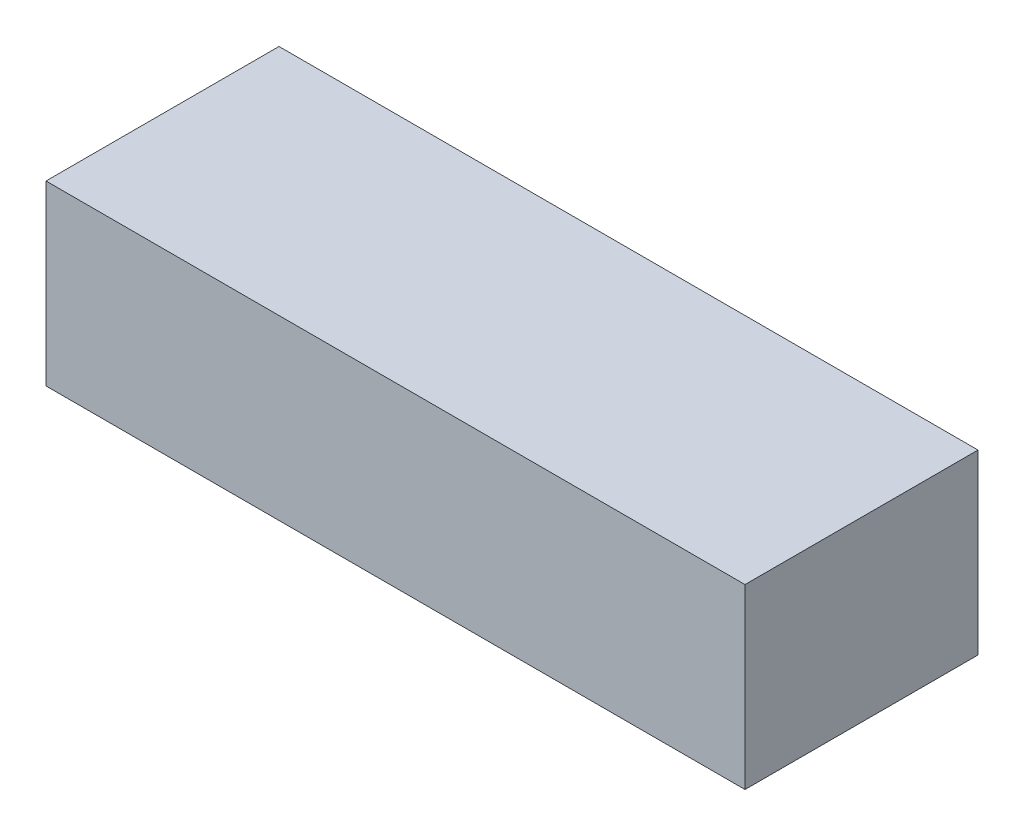
ISO-10303-21;
HEADER;
FILE_DESCRIPTION(('STEP AP214'),'2;1');
FILE_NAME('part.step','',(''),(''),'','','');
FILE_SCHEMA(('AUTOMOTIVE_DESIGN { 1 0 10303 214 1 1 1 1 }'));
ENDSEC;
DATA;
#1=APPLICATION_CONTEXT('core data for automotive mechanical design processes');
#2=APPLICATION_PROTOCOL_DEFINITION('international standard','automotive_design',2000,#1);
#3=PRODUCT_CONTEXT('',#1,'mechanical');
#4=PRODUCT('Part','Part','',(#3));
#5=PRODUCT_RELATED_PRODUCT_CATEGORY('part','',(#4));
#6=PRODUCT_DEFINITION_FORMATION('','',#4);
#7=PRODUCT_DEFINITION_CONTEXT('part definition',#1,'design');
#8=PRODUCT_DEFINITION('design','',#6,#7);
#9=PRODUCT_DEFINITION_SHAPE('','',#8);
#10=(LENGTH_UNIT() NAMED_UNIT(*) SI_UNIT(.MILLI.,.METRE.));
#11=(NAMED_UNIT(*) PLANE_ANGLE_UNIT() SI_UNIT($,.RADIAN.));
#12=(NAMED_UNIT(*) SI_UNIT($,.STERADIAN.) SOLID_ANGLE_UNIT());
#13=UNCERTAINTY_MEASURE_WITH_UNIT(LENGTH_MEASURE(1.E-05),#10,'distance_accuracy_value','');
#14=(GEOMETRIC_REPRESENTATION_CONTEXT(3) GLOBAL_UNCERTAINTY_ASSIGNED_CONTEXT((#13)) GLOBAL_UNIT_ASSIGNED_CONTEXT((#10,
#11,#12)) REPRESENTATION_CONTEXT('',''));
#15=CARTESIAN_POINT('',(0.,0.,0.));
#16=DIRECTION('',(0.,0.,1.));
#17=DIRECTION('',(1.,0.,0.));
#18=AXIS2_PLACEMENT_3D('',#15,#16,#17);
#19=CARTESIAN_POINT('',(0.,0.,21.));
#20=DIRECTION('',(1.,0.,0.));
#21=DIRECTION('',(0.,1.,0.));
#22=AXIS2_PLACEMENT_3D('',#19,#20,#21);
#23=PLANE('',#22);
#24=DIRECTION('',(0.,-1.,0.));
#25=VECTOR('',#24,1.);
#26=CARTESIAN_POINT('',(0.,0.,0.));
#27=LINE('',#26,#25);
#28=CARTESIAN_POINT('',(0.,16.,0.));
#29=VERTEX_POINT('',#28);
#30=CARTESIAN_POINT('',(0.,0.,0.));
#31=VERTEX_POINT('',#30);
#32=EDGE_CURVE('E99',#29,#31,#27,.T.);
#33=ORIENTED_EDGE('',*,*,#32,.T.);
#34=DIRECTION('',(0.,0.,-1.));
#35=VECTOR('',#34,1.);
#36=CARTESIAN_POINT('',(0.,0.,21.));
#37=LINE('',#36,#35);
#38=CARTESIAN_POINT('',(0.,0.,21.));
#39=VERTEX_POINT('',#38);
#40=EDGE_CURVE('E11',#39,#31,#37,.T.);
#41=ORIENTED_EDGE('',*,*,#40,.F.);
#42=DIRECTION('',(0.,-1.,0.));
#43=VECTOR('',#42,1.);
#44=CARTESIAN_POINT('',(0.,0.,21.));
#45=LINE('',#44,#43);
#46=CARTESIAN_POINT('',(0.,16.,21.));
#47=VERTEX_POINT('',#46);
#48=EDGE_CURVE('E87',#47,#39,#45,.T.);
#49=ORIENTED_EDGE('',*,*,#48,.F.);
#50=DIRECTION('',(0.,0.,-1.));
#51=VECTOR('',#50,1.);
#52=CARTESIAN_POINT('',(0.,16.,21.));
#53=LINE('',#52,#51);
#54=EDGE_CURVE('E95',#47,#29,#53,.T.);
#55=ORIENTED_EDGE('',*,*,#54,.T.);
#56=EDGE_LOOP('',(#33,#41,#49,#55));
#57=FACE_BOUND('',#56,.T.);
#58=ADVANCED_FACE('F36',(#57),#23,.F.);
#59=CARTESIAN_POINT('',(0.,0.,21.));
#60=DIRECTION('',(0.,1.,0.));
#61=DIRECTION('',(0.,0.,1.));
#62=AXIS2_PLACEMENT_3D('',#59,#60,#61);
#63=PLANE('',#62);
#64=DIRECTION('',(1.,0.,0.));
#65=VECTOR('',#64,1.);
#66=CARTESIAN_POINT('',(0.,0.,0.));
#67=LINE('',#66,#65);
#68=CARTESIAN_POINT('',(63.,0.,0.));
#69=VERTEX_POINT('',#68);
#70=EDGE_CURVE('E91',#31,#69,#67,.T.);
#71=ORIENTED_EDGE('',*,*,#70,.T.);
#72=DIRECTION('',(0.,0.,-1.));
#73=VECTOR('',#72,1.);
#74=CARTESIAN_POINT('',(63.,0.,21.));
#75=LINE('',#74,#73);
#76=CARTESIAN_POINT('',(63.,0.,21.));
#77=VERTEX_POINT('',#76);
#78=EDGE_CURVE('E44',#77,#69,#75,.T.);
#79=ORIENTED_EDGE('',*,*,#78,.F.);
#80=DIRECTION('',(1.,0.,0.));
#81=VECTOR('',#80,1.);
#82=CARTESIAN_POINT('',(0.,0.,21.));
#83=LINE('',#82,#81);
#84=EDGE_CURVE('E82',#39,#77,#83,.T.);
#85=ORIENTED_EDGE('',*,*,#84,.F.);
#86=ORIENTED_EDGE('',*,*,#40,.T.);
#87=EDGE_LOOP('',(#71,#79,#85,#86));
#88=FACE_BOUND('',#87,.T.);
#89=ADVANCED_FACE('F90',(#88),#63,.F.);
#90=CARTESIAN_POINT('',(63.,0.,21.));
#91=DIRECTION('',(-1.,0.,0.));
#92=DIRECTION('',(0.,-1.,0.));
#93=AXIS2_PLACEMENT_3D('',#90,#91,#92);
#94=PLANE('',#93);
#95=DIRECTION('',(0.,1.,0.));
#96=VECTOR('',#95,1.);
#97=CARTESIAN_POINT('',(63.,0.,0.));
#98=LINE('',#97,#96);
#99=CARTESIAN_POINT('',(63.,16.,0.));
#100=VERTEX_POINT('',#99);
#101=EDGE_CURVE('E69',#69,#100,#98,.T.);
#102=ORIENTED_EDGE('',*,*,#101,.T.);
#103=DIRECTION('',(0.,0.,-1.));
#104=VECTOR('',#103,1.);
#105=CARTESIAN_POINT('',(63.,16.,21.));
#106=LINE('',#105,#104);
#107=CARTESIAN_POINT('',(63.,16.,21.));
#108=VERTEX_POINT('',#107);
#109=EDGE_CURVE('E92',#108,#100,#106,.T.);
#110=ORIENTED_EDGE('',*,*,#109,.F.);
#111=DIRECTION('',(0.,1.,0.));
#112=VECTOR('',#111,1.);
#113=CARTESIAN_POINT('',(63.,0.,21.));
#114=LINE('',#113,#112);
#115=EDGE_CURVE('E85',#77,#108,#114,.T.);
#116=ORIENTED_EDGE('',*,*,#115,.F.);
#117=ORIENTED_EDGE('',*,*,#78,.T.);
#118=EDGE_LOOP('',(#102,#110,#116,#117));
#119=FACE_BOUND('',#118,.T.);
#120=ADVANCED_FACE('F93',(#119),#94,.F.);
#121=CARTESIAN_POINT('',(0.,16.,21.));
#122=DIRECTION('',(0.,-1.,0.));
#123=DIRECTION('',(0.,0.,-1.));
#124=AXIS2_PLACEMENT_3D('',#121,#122,#123);
#125=PLANE('',#124);
#126=DIRECTION('',(-1.,0.,0.));
#127=VECTOR('',#126,1.);
#128=CARTESIAN_POINT('',(0.,16.,0.));
#129=LINE('',#128,#127);
#130=EDGE_CURVE('E75',#100,#29,#129,.T.);
#131=ORIENTED_EDGE('',*,*,#130,.T.);
#132=ORIENTED_EDGE('',*,*,#54,.F.);
#133=DIRECTION('',(-1.,0.,0.));
#134=VECTOR('',#133,1.);
#135=CARTESIAN_POINT('',(0.,16.,21.));
#136=LINE('',#135,#134);
#137=EDGE_CURVE('E52',#108,#47,#136,.T.);
#138=ORIENTED_EDGE('',*,*,#137,.F.);
#139=ORIENTED_EDGE('',*,*,#109,.T.);
#140=EDGE_LOOP('',(#131,#132,#138,#139));
#141=FACE_BOUND('',#140,.T.);
#142=ADVANCED_FACE('F106',(#141),#125,.F.);
#143=CARTESIAN_POINT('',(0.,0.,21.));
#144=DIRECTION('',(0.,0.,-1.));
#145=DIRECTION('',(-1.,0.,0.));
#146=AXIS2_PLACEMENT_3D('',#143,#144,#145);
#147=PLANE('',#146);
#148=ORIENTED_EDGE('',*,*,#48,.T.);
#149=ORIENTED_EDGE('',*,*,#84,.T.);
#150=ORIENTED_EDGE('',*,*,#115,.T.);
#151=ORIENTED_EDGE('',*,*,#137,.T.);
#152=EDGE_LOOP('',(#148,#149,#150,#151));
#153=FACE_BOUND('',#152,.T.);
#154=ADVANCED_FACE('F83',(#153),#147,.F.);
#155=CARTESIAN_POINT('',(0.,0.,0.));
#156=DIRECTION('',(0.,0.,-1.));
#157=DIRECTION('',(-1.,0.,0.));
#158=AXIS2_PLACEMENT_3D('',#155,#156,#157);
#159=PLANE('',#158);
#160=ORIENTED_EDGE('',*,*,#32,.F.);
#161=ORIENTED_EDGE('',*,*,#130,.F.);
#162=ORIENTED_EDGE('',*,*,#101,.F.);
#163=ORIENTED_EDGE('',*,*,#70,.F.);
#164=EDGE_LOOP('',(#160,#161,#162,#163));
#165=FACE_BOUND('',#164,.T.);
#166=ADVANCED_FACE('F109',(#165),#159,.T.);
#167=CLOSED_SHELL('',(#58,#89,#120,#142,#154,#166));
#168=MANIFOLD_SOLID_BREP('B2',#167);
#169=ADVANCED_BREP_SHAPE_REPRESENTATION('',(#18,#168),#14);
#170=SHAPE_DEFINITION_REPRESENTATION(#9,#169);
ENDSEC;
END-ISO-10303-21;
